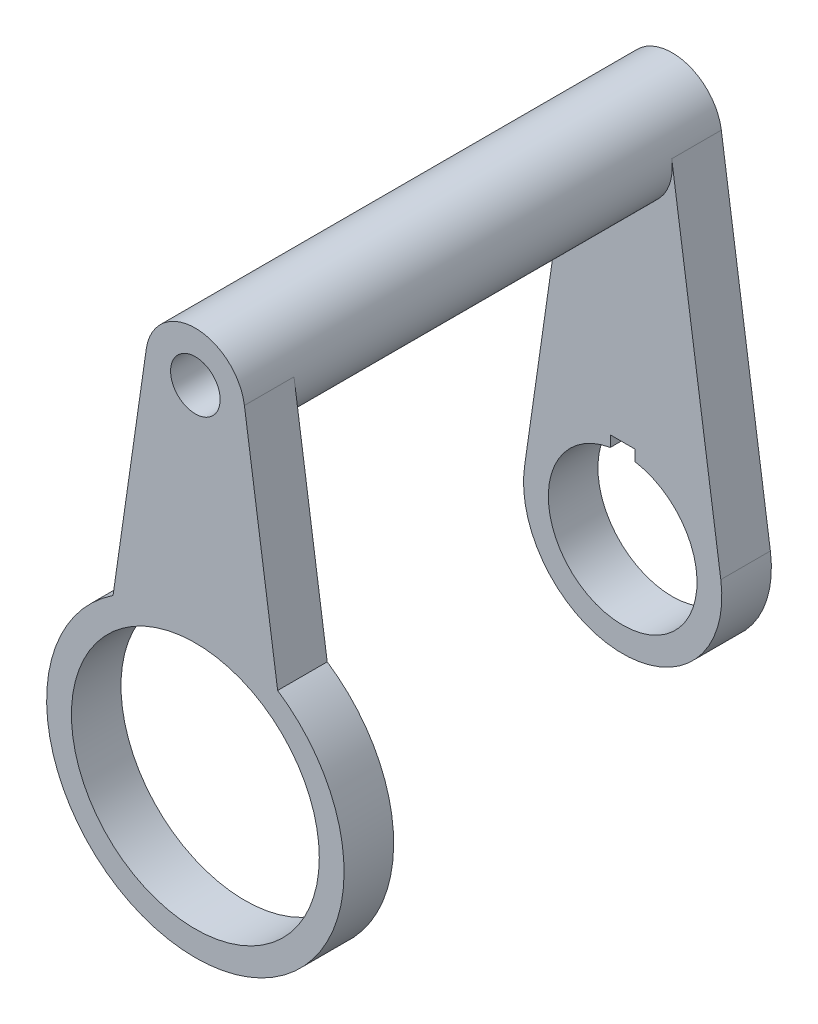
ISO-10303-21;
HEADER;
FILE_DESCRIPTION(('STEP AP214'),'2;1');
FILE_NAME('part.step','',(''),(''),'','','');
FILE_SCHEMA(('AUTOMOTIVE_DESIGN { 1 0 10303 214 1 1 1 1 }'));
ENDSEC;
DATA;
#1=APPLICATION_CONTEXT('core data for automotive mechanical design processes');
#2=APPLICATION_PROTOCOL_DEFINITION('international standard','automotive_design',2000,#1);
#3=PRODUCT_CONTEXT('',#1,'mechanical');
#4=PRODUCT('Part','Part','',(#3));
#5=PRODUCT_RELATED_PRODUCT_CATEGORY('part','',(#4));
#6=PRODUCT_DEFINITION_FORMATION('','',#4);
#7=PRODUCT_DEFINITION_CONTEXT('part definition',#1,'design');
#8=PRODUCT_DEFINITION('design','',#6,#7);
#9=PRODUCT_DEFINITION_SHAPE('','',#8);
#10=(LENGTH_UNIT() NAMED_UNIT(*) SI_UNIT(.MILLI.,.METRE.));
#11=(NAMED_UNIT(*) PLANE_ANGLE_UNIT() SI_UNIT($,.RADIAN.));
#12=(NAMED_UNIT(*) SI_UNIT($,.STERADIAN.) SOLID_ANGLE_UNIT());
#13=UNCERTAINTY_MEASURE_WITH_UNIT(LENGTH_MEASURE(1.E-05),#10,'distance_accuracy_value','');
#14=(GEOMETRIC_REPRESENTATION_CONTEXT(3) GLOBAL_UNCERTAINTY_ASSIGNED_CONTEXT((#13)) GLOBAL_UNIT_ASSIGNED_CONTEXT((#10,
#11,#12)) REPRESENTATION_CONTEXT('',''));
#15=CARTESIAN_POINT('',(0.,0.,0.));
#16=DIRECTION('',(0.,0.,1.));
#17=DIRECTION('',(1.,0.,0.));
#18=AXIS2_PLACEMENT_3D('',#15,#16,#17);
#19=CARTESIAN_POINT('',(0.,0.,10.));
#20=DIRECTION('',(0.,0.,1.));
#21=DIRECTION('',(1.,0.,0.));
#22=AXIS2_PLACEMENT_3D('',#19,#20,#21);
#23=PLANE('',#22);
#24=CARTESIAN_POINT('',(0.,70.,10.));
#25=DIRECTION('',(0.,0.,1.));
#26=DIRECTION('',(1.,0.,0.));
#27=AXIS2_PLACEMENT_3D('',#24,#25,#26);
#28=CIRCLE('',#27,10.);
#29=CARTESIAN_POINT('',(-9.89743318610788,71.4285714285714,10.));
#30=VERTEX_POINT('',#29);
#31=CARTESIAN_POINT('',(9.89743318610788,71.4285714285714,10.));
#32=VERTEX_POINT('',#31);
#33=EDGE_CURVE('E54',#30,#32,#28,.T.);
#34=ORIENTED_EDGE('',*,*,#33,.F.);
#35=DIRECTION('',(-0.142857142857143,-0.989743318610787,0.));
#36=VECTOR('',#35,1.);
#37=CARTESIAN_POINT('',(-19.7948663722158,2.85714285714286,10.));
#38=LINE('',#37,#36);
#39=CARTESIAN_POINT('',(-19.7948663722158,2.85714285714286,10.));
#40=VERTEX_POINT('',#39);
#41=EDGE_CURVE('E235',#30,#40,#38,.T.);
#42=ORIENTED_EDGE('',*,*,#41,.T.);
#43=CARTESIAN_POINT('',(0.,0.,10.));
#44=DIRECTION('',(0.,0.,1.));
#45=DIRECTION('',(1.,0.,0.));
#46=AXIS2_PLACEMENT_3D('',#43,#44,#45);
#47=CIRCLE('',#46,20.);
#48=CARTESIAN_POINT('',(19.7948663722157,2.85714285714286,10.));
#49=VERTEX_POINT('',#48);
#50=EDGE_CURVE('E226',#40,#49,#47,.T.);
#51=ORIENTED_EDGE('',*,*,#50,.T.);
#52=DIRECTION('',(-0.142857142857143,0.989743318610787,0.));
#53=VECTOR('',#52,1.);
#54=CARTESIAN_POINT('',(9.89743318610787,71.4285714285714,10.));
#55=LINE('',#54,#53);
#56=EDGE_CURVE('E230',#49,#32,#55,.T.);
#57=ORIENTED_EDGE('',*,*,#56,.T.);
#58=EDGE_LOOP('',(#34,#42,#51,#57));
#59=FACE_BOUND('',#58,.T.);
#60=DIRECTION('',(0.,1.,0.));
#61=VECTOR('',#60,1.);
#62=CARTESIAN_POINT('',(2.5,17.,10.));
#63=LINE('',#62,#61);
#64=CARTESIAN_POINT('',(2.5,14.790199457749,10.));
#65=VERTEX_POINT('',#64);
#66=CARTESIAN_POINT('',(2.5,17.,10.));
#67=VERTEX_POINT('',#66);
#68=EDGE_CURVE('E188',#65,#67,#63,.T.);
#69=ORIENTED_EDGE('',*,*,#68,.F.);
#70=CARTESIAN_POINT('',(0.,0.,10.));
#71=DIRECTION('',(0.,0.,1.));
#72=DIRECTION('',(1.,0.,0.));
#73=AXIS2_PLACEMENT_3D('',#70,#71,#72);
#74=CIRCLE('',#73,15.);
#75=CARTESIAN_POINT('',(-2.5,14.790199457749,10.));
#76=VERTEX_POINT('',#75);
#77=EDGE_CURVE('E185',#76,#65,#74,.T.);
#78=ORIENTED_EDGE('',*,*,#77,.F.);
#79=DIRECTION('',(0.,-1.,0.));
#80=VECTOR('',#79,1.);
#81=CARTESIAN_POINT('',(-2.5,14.790199457749,10.));
#82=LINE('',#81,#80);
#83=CARTESIAN_POINT('',(-2.5,17.,10.));
#84=VERTEX_POINT('',#83);
#85=EDGE_CURVE('E195',#84,#76,#82,.T.);
#86=ORIENTED_EDGE('',*,*,#85,.F.);
#87=DIRECTION('',(-1.,0.,0.));
#88=VECTOR('',#87,1.);
#89=CARTESIAN_POINT('',(-2.5,17.,10.));
#90=LINE('',#89,#88);
#91=EDGE_CURVE('E192',#67,#84,#90,.T.);
#92=ORIENTED_EDGE('',*,*,#91,.F.);
#93=EDGE_LOOP('',(#69,#78,#86,#92));
#94=FACE_BOUND('',#93,.T.);
#95=ADVANCED_FACE('F45',(#59,#94),#23,.T.);
#96=CARTESIAN_POINT('',(0.,0.,0.));
#97=DIRECTION('',(0.,0.,1.));
#98=DIRECTION('',(1.,0.,0.));
#99=AXIS2_PLACEMENT_3D('',#96,#97,#98);
#100=PLANE('',#99);
#101=CARTESIAN_POINT('',(0.,0.,0.));
#102=DIRECTION('',(0.,0.,1.));
#103=DIRECTION('',(1.,0.,0.));
#104=AXIS2_PLACEMENT_3D('',#101,#102,#103);
#105=CIRCLE('',#104,20.);
#106=CARTESIAN_POINT('',(-19.7948663722158,2.85714285714286,0.));
#107=VERTEX_POINT('',#106);
#108=CARTESIAN_POINT('',(19.7948663722157,2.85714285714286,0.));
#109=VERTEX_POINT('',#108);
#110=EDGE_CURVE('E225',#107,#109,#105,.T.);
#111=ORIENTED_EDGE('',*,*,#110,.F.);
#112=DIRECTION('',(-0.142857142857143,-0.989743318610787,0.));
#113=VECTOR('',#112,1.);
#114=CARTESIAN_POINT('',(-19.7948663722158,2.85714285714286,0.));
#115=LINE('',#114,#113);
#116=CARTESIAN_POINT('',(-9.89743318610788,71.4285714285714,0.));
#117=VERTEX_POINT('',#116);
#118=EDGE_CURVE('E231',#117,#107,#115,.T.);
#119=ORIENTED_EDGE('',*,*,#118,.F.);
#120=CARTESIAN_POINT('',(0.,70.,0.));
#121=DIRECTION('',(0.,0.,1.));
#122=DIRECTION('',(1.,0.,0.));
#123=AXIS2_PLACEMENT_3D('',#120,#121,#122);
#124=CIRCLE('',#123,10.);
#125=CARTESIAN_POINT('',(9.89743318610787,71.4285714285714,0.));
#126=VERTEX_POINT('',#125);
#127=EDGE_CURVE('E245',#126,#117,#124,.T.);
#128=ORIENTED_EDGE('',*,*,#127,.F.);
#129=DIRECTION('',(-0.142857142857143,0.989743318610787,0.));
#130=VECTOR('',#129,1.);
#131=CARTESIAN_POINT('',(9.89743318610787,71.4285714285714,0.));
#132=LINE('',#131,#130);
#133=EDGE_CURVE('E242',#109,#126,#132,.T.);
#134=ORIENTED_EDGE('',*,*,#133,.F.);
#135=EDGE_LOOP('',(#111,#119,#128,#134));
#136=FACE_BOUND('',#135,.T.);
#137=CARTESIAN_POINT('',(0.,0.,0.));
#138=DIRECTION('',(0.,0.,1.));
#139=DIRECTION('',(1.,0.,0.));
#140=AXIS2_PLACEMENT_3D('',#137,#138,#139);
#141=CIRCLE('',#140,15.);
#142=CARTESIAN_POINT('',(-2.5,14.790199457749,0.));
#143=VERTEX_POINT('',#142);
#144=CARTESIAN_POINT('',(2.5,14.790199457749,0.));
#145=VERTEX_POINT('',#144);
#146=EDGE_CURVE('E184',#143,#145,#141,.T.);
#147=ORIENTED_EDGE('',*,*,#146,.T.);
#148=DIRECTION('',(0.,1.,0.));
#149=VECTOR('',#148,1.);
#150=CARTESIAN_POINT('',(2.5,17.,0.));
#151=LINE('',#150,#149);
#152=CARTESIAN_POINT('',(2.5,17.,0.));
#153=VERTEX_POINT('',#152);
#154=EDGE_CURVE('E202',#145,#153,#151,.T.);
#155=ORIENTED_EDGE('',*,*,#154,.T.);
#156=DIRECTION('',(-1.,0.,0.));
#157=VECTOR('',#156,1.);
#158=CARTESIAN_POINT('',(-2.5,17.,0.));
#159=LINE('',#158,#157);
#160=CARTESIAN_POINT('',(-2.5,17.,0.));
#161=VERTEX_POINT('',#160);
#162=EDGE_CURVE('E206',#153,#161,#159,.T.);
#163=ORIENTED_EDGE('',*,*,#162,.T.);
#164=DIRECTION('',(0.,-1.,0.));
#165=VECTOR('',#164,1.);
#166=CARTESIAN_POINT('',(-2.5,14.790199457749,0.));
#167=LINE('',#166,#165);
#168=EDGE_CURVE('E189',#161,#143,#167,.T.);
#169=ORIENTED_EDGE('',*,*,#168,.T.);
#170=EDGE_LOOP('',(#147,#155,#163,#169));
#171=FACE_BOUND('',#170,.T.);
#172=CARTESIAN_POINT('',(0.,70.,0.));
#173=DIRECTION('',(0.,0.,1.));
#174=DIRECTION('',(1.,0.,0.));
#175=AXIS2_PLACEMENT_3D('',#172,#173,#174);
#176=CIRCLE('',#175,5.);
#177=CARTESIAN_POINT('',(5.,70.,0.));
#178=VERTEX_POINT('',#177);
#179=EDGE_CURVE('E176',#178,#178,#176,.T.);
#180=ORIENTED_EDGE('',*,*,#179,.T.);
#181=EDGE_LOOP('',(#180));
#182=FACE_BOUND('',#181,.T.);
#183=ADVANCED_FACE('F271',(#136,#171,#182),#100,.F.);
#184=CARTESIAN_POINT('',(0.,0.,10.));
#185=DIRECTION('',(0.,0.,-1.));
#186=DIRECTION('',(-1.,0.,0.));
#187=AXIS2_PLACEMENT_3D('',#184,#185,#186);
#188=CYLINDRICAL_SURFACE('',#187,20.);
#189=ORIENTED_EDGE('',*,*,#110,.T.);
#190=DIRECTION('',(0.,0.,-1.));
#191=VECTOR('',#190,1.);
#192=CARTESIAN_POINT('',(19.7948663722157,2.85714285714286,10.));
#193=LINE('',#192,#191);
#194=EDGE_CURVE('E180',#49,#109,#193,.T.);
#195=ORIENTED_EDGE('',*,*,#194,.F.);
#196=ORIENTED_EDGE('',*,*,#50,.F.);
#197=DIRECTION('',(0.,0.,-1.));
#198=VECTOR('',#197,1.);
#199=CARTESIAN_POINT('',(-19.7948663722158,2.85714285714286,10.));
#200=LINE('',#199,#198);
#201=EDGE_CURVE('E238',#40,#107,#200,.T.);
#202=ORIENTED_EDGE('',*,*,#201,.T.);
#203=EDGE_LOOP('',(#189,#195,#196,#202));
#204=FACE_BOUND('',#203,.T.);
#205=ADVANCED_FACE('F47',(#204),#188,.T.);
#206=CARTESIAN_POINT('',(9.89743318610787,71.4285714285714,10.));
#207=DIRECTION('',(-0.989743318610787,-0.142857142857143,0.));
#208=DIRECTION('',(0.142857142857143,-0.989743318610787,0.));
#209=AXIS2_PLACEMENT_3D('',#206,#207,#208);
#210=PLANE('',#209);
#211=ORIENTED_EDGE('',*,*,#133,.T.);
#212=DIRECTION('',(0.,0.,-1.));
#213=VECTOR('',#212,1.);
#214=CARTESIAN_POINT('',(9.89743318610787,71.4285714285714,10.));
#215=LINE('',#214,#213);
#216=EDGE_CURVE('E257',#32,#126,#215,.T.);
#217=ORIENTED_EDGE('',*,*,#216,.F.);
#218=ORIENTED_EDGE('',*,*,#56,.F.);
#219=ORIENTED_EDGE('',*,*,#194,.T.);
#220=EDGE_LOOP('',(#211,#217,#218,#219));
#221=FACE_BOUND('',#220,.T.);
#222=ADVANCED_FACE('F264',(#221),#210,.F.);
#223=CARTESIAN_POINT('',(0.,70.,10.));
#224=DIRECTION('',(0.,0.,-1.));
#225=DIRECTION('',(-1.,0.,0.));
#226=AXIS2_PLACEMENT_3D('',#223,#224,#225);
#227=CYLINDRICAL_SURFACE('',#226,10.);
#228=ORIENTED_EDGE('',*,*,#127,.T.);
#229=DIRECTION('',(0.,0.,-1.));
#230=VECTOR('',#229,1.);
#231=CARTESIAN_POINT('',(-9.89743318610788,71.4285714285714,10.));
#232=LINE('',#231,#230);
#233=EDGE_CURVE('E253',#30,#117,#232,.T.);
#234=ORIENTED_EDGE('',*,*,#233,.F.);
#235=ORIENTED_EDGE('',*,*,#33,.T.);
#236=ORIENTED_EDGE('',*,*,#216,.T.);
#237=EDGE_LOOP('',(#228,#234,#235,#236));
#238=FACE_BOUND('',#237,.T.);
#239=CARTESIAN_POINT('',(0.,70.,86.2));
#240=DIRECTION('',(0.,0.,1.));
#241=DIRECTION('',(1.,0.,0.));
#242=AXIS2_PLACEMENT_3D('',#239,#240,#241);
#243=CIRCLE('',#242,10.);
#244=CARTESIAN_POINT('',(-9.89743318610788,71.4285714285714,86.2));
#245=VERTEX_POINT('',#244);
#246=CARTESIAN_POINT('',(9.89743318610787,71.4285714285714,86.2));
#247=VERTEX_POINT('',#246);
#248=EDGE_CURVE('E173',#245,#247,#243,.T.);
#249=ORIENTED_EDGE('',*,*,#248,.F.);
#250=DIRECTION('',(0.,0.,-1.));
#251=VECTOR('',#250,1.);
#252=CARTESIAN_POINT('',(-9.89743318610788,71.4285714285714,96.2));
#253=LINE('',#252,#251);
#254=CARTESIAN_POINT('',(-9.89743318610788,71.4285714285714,96.2));
#255=VERTEX_POINT('',#254);
#256=EDGE_CURVE('E154',#255,#245,#253,.T.);
#257=ORIENTED_EDGE('',*,*,#256,.F.);
#258=CARTESIAN_POINT('',(0.,70.,96.2));
#259=DIRECTION('',(0.,0.,1.));
#260=DIRECTION('',(1.,0.,0.));
#261=AXIS2_PLACEMENT_3D('',#258,#259,#260);
#262=CIRCLE('',#261,10.);
#263=CARTESIAN_POINT('',(9.89743318610787,71.4285714285714,96.2));
#264=VERTEX_POINT('',#263);
#265=EDGE_CURVE('E159',#264,#255,#262,.T.);
#266=ORIENTED_EDGE('',*,*,#265,.F.);
#267=DIRECTION('',(0.,0.,-1.));
#268=VECTOR('',#267,1.);
#269=CARTESIAN_POINT('',(9.89743318610787,71.4285714285714,96.2));
#270=LINE('',#269,#268);
#271=EDGE_CURVE('E167',#264,#247,#270,.T.);
#272=ORIENTED_EDGE('',*,*,#271,.T.);
#273=EDGE_LOOP('',(#249,#257,#266,#272));
#274=FACE_BOUND('',#273,.T.);
#275=ADVANCED_FACE('F276',(#238,#274),#227,.T.);
#276=CARTESIAN_POINT('',(-19.7948663722158,2.85714285714286,10.));
#277=DIRECTION('',(0.989743318610787,-0.142857142857143,0.));
#278=DIRECTION('',(0.142857142857143,0.989743318610787,0.));
#279=AXIS2_PLACEMENT_3D('',#276,#277,#278);
#280=PLANE('',#279);
#281=ORIENTED_EDGE('',*,*,#118,.T.);
#282=ORIENTED_EDGE('',*,*,#201,.F.);
#283=ORIENTED_EDGE('',*,*,#41,.F.);
#284=ORIENTED_EDGE('',*,*,#233,.T.);
#285=EDGE_LOOP('',(#281,#282,#283,#284));
#286=FACE_BOUND('',#285,.T.);
#287=ADVANCED_FACE('F280',(#286),#280,.F.);
#288=CARTESIAN_POINT('',(0.,0.,10.));
#289=DIRECTION('',(0.,0.,-1.));
#290=DIRECTION('',(-1.,0.,0.));
#291=AXIS2_PLACEMENT_3D('',#288,#289,#290);
#292=CYLINDRICAL_SURFACE('',#291,15.);
#293=ORIENTED_EDGE('',*,*,#146,.F.);
#294=DIRECTION('',(0.,0.,-1.));
#295=VECTOR('',#294,1.);
#296=CARTESIAN_POINT('',(-2.5,14.790199457749,10.));
#297=LINE('',#296,#295);
#298=EDGE_CURVE('E198',#76,#143,#297,.T.);
#299=ORIENTED_EDGE('',*,*,#298,.F.);
#300=ORIENTED_EDGE('',*,*,#77,.T.);
#301=DIRECTION('',(0.,0.,-1.));
#302=VECTOR('',#301,1.);
#303=CARTESIAN_POINT('',(2.5,14.790199457749,10.));
#304=LINE('',#303,#302);
#305=EDGE_CURVE('E221',#65,#145,#304,.T.);
#306=ORIENTED_EDGE('',*,*,#305,.T.);
#307=EDGE_LOOP('',(#293,#299,#300,#306));
#308=FACE_BOUND('',#307,.T.);
#309=ADVANCED_FACE('F298',(#308),#292,.F.);
#310=CARTESIAN_POINT('',(2.5,17.,10.));
#311=DIRECTION('',(-1.,0.,0.));
#312=DIRECTION('',(0.,0.,1.));
#313=AXIS2_PLACEMENT_3D('',#310,#311,#312);
#314=PLANE('',#313);
#315=ORIENTED_EDGE('',*,*,#154,.F.);
#316=ORIENTED_EDGE('',*,*,#305,.F.);
#317=ORIENTED_EDGE('',*,*,#68,.T.);
#318=DIRECTION('',(0.,0.,-1.));
#319=VECTOR('',#318,1.);
#320=CARTESIAN_POINT('',(2.5,17.,10.));
#321=LINE('',#320,#319);
#322=EDGE_CURVE('E218',#67,#153,#321,.T.);
#323=ORIENTED_EDGE('',*,*,#322,.T.);
#324=EDGE_LOOP('',(#315,#316,#317,#323));
#325=FACE_BOUND('',#324,.T.);
#326=ADVANCED_FACE('F292',(#325),#314,.T.);
#327=CARTESIAN_POINT('',(-2.5,17.,10.));
#328=DIRECTION('',(0.,-1.,0.));
#329=DIRECTION('',(0.,0.,-1.));
#330=AXIS2_PLACEMENT_3D('',#327,#328,#329);
#331=PLANE('',#330);
#332=ORIENTED_EDGE('',*,*,#162,.F.);
#333=ORIENTED_EDGE('',*,*,#322,.F.);
#334=ORIENTED_EDGE('',*,*,#91,.T.);
#335=DIRECTION('',(0.,0.,-1.));
#336=VECTOR('',#335,1.);
#337=CARTESIAN_POINT('',(-2.5,17.,10.));
#338=LINE('',#337,#336);
#339=EDGE_CURVE('E69',#84,#161,#338,.T.);
#340=ORIENTED_EDGE('',*,*,#339,.T.);
#341=EDGE_LOOP('',(#332,#333,#334,#340));
#342=FACE_BOUND('',#341,.T.);
#343=ADVANCED_FACE('F295',(#342),#331,.T.);
#344=CARTESIAN_POINT('',(-2.5,14.790199457749,10.));
#345=DIRECTION('',(1.,0.,0.));
#346=DIRECTION('',(0.,0.,-1.));
#347=AXIS2_PLACEMENT_3D('',#344,#345,#346);
#348=PLANE('',#347);
#349=ORIENTED_EDGE('',*,*,#168,.F.);
#350=ORIENTED_EDGE('',*,*,#339,.F.);
#351=ORIENTED_EDGE('',*,*,#85,.T.);
#352=ORIENTED_EDGE('',*,*,#298,.T.);
#353=EDGE_LOOP('',(#349,#350,#351,#352));
#354=FACE_BOUND('',#353,.T.);
#355=ADVANCED_FACE('F300',(#354),#348,.T.);
#356=CARTESIAN_POINT('',(0.,70.,10.));
#357=DIRECTION('',(0.,0.,-1.));
#358=DIRECTION('',(-1.,0.,0.));
#359=AXIS2_PLACEMENT_3D('',#356,#357,#358);
#360=CYLINDRICAL_SURFACE('',#359,5.);
#361=ORIENTED_EDGE('',*,*,#179,.F.);
#362=EDGE_LOOP('',(#361));
#363=FACE_BOUND('',#362,.T.);
#364=CARTESIAN_POINT('',(0.,70.,96.2));
#365=DIRECTION('',(0.,0.,1.));
#366=DIRECTION('',(1.,0.,0.));
#367=AXIS2_PLACEMENT_3D('',#364,#365,#366);
#368=CIRCLE('',#367,5.);
#369=CARTESIAN_POINT('',(5.,70.,96.2));
#370=VERTEX_POINT('',#369);
#371=EDGE_CURVE('E143',#370,#370,#368,.T.);
#372=ORIENTED_EDGE('',*,*,#371,.T.);
#373=EDGE_LOOP('',(#372));
#374=FACE_BOUND('',#373,.T.);
#375=ADVANCED_FACE('F302',(#363,#374),#360,.F.);
#376=CARTESIAN_POINT('',(0.,70.,86.2));
#377=DIRECTION('',(0.,0.,1.));
#378=DIRECTION('',(1.,0.,0.));
#379=AXIS2_PLACEMENT_3D('',#376,#377,#378);
#380=PLANE('',#379);
#381=CARTESIAN_POINT('',(0.,0.,86.2));
#382=DIRECTION('',(0.,0.,1.));
#383=DIRECTION('',(1.,0.,0.));
#384=AXIS2_PLACEMENT_3D('',#381,#382,#383);
#385=CIRCLE('',#384,25.);
#386=CARTESIAN_POINT('',(25.,0.,86.2));
#387=VERTEX_POINT('',#386);
#388=EDGE_CURVE('E463',#387,#387,#385,.F.);
#389=ORIENTED_EDGE('',*,*,#388,.F.);
#390=EDGE_LOOP('',(#389));
#391=FACE_BOUND('',#390,.T.);
#392=DIRECTION('',(0.142857142857143,-0.989743318610787,0.));
#393=VECTOR('',#392,1.);
#394=CARTESIAN_POINT('',(9.89743318610787,71.4285714285714,86.2));
#395=LINE('',#394,#393);
#396=CARTESIAN_POINT('',(16.600483547216,24.9884762640424,86.2));
#397=VERTEX_POINT('',#396);
#398=EDGE_CURVE('E148',#247,#397,#395,.T.);
#399=ORIENTED_EDGE('',*,*,#398,.T.);
#400=CARTESIAN_POINT('',(0.,0.,86.2));
#401=DIRECTION('',(0.,0.,1.));
#402=DIRECTION('',(1.,0.,0.));
#403=AXIS2_PLACEMENT_3D('',#400,#401,#402);
#404=CIRCLE('',#403,30.);
#405=CARTESIAN_POINT('',(-16.6004835472161,24.9884762640424,86.2));
#406=VERTEX_POINT('',#405);
#407=EDGE_CURVE('E136',#397,#406,#404,.F.);
#408=ORIENTED_EDGE('',*,*,#407,.T.);
#409=DIRECTION('',(0.142857142857143,0.989743318610787,0.));
#410=VECTOR('',#409,1.);
#411=CARTESIAN_POINT('',(-9.89743318610788,71.4285714285714,86.2));
#412=LINE('',#411,#410);
#413=EDGE_CURVE('E61',#406,#245,#412,.T.);
#414=ORIENTED_EDGE('',*,*,#413,.T.);
#415=ORIENTED_EDGE('',*,*,#248,.T.);
#416=EDGE_LOOP('',(#399,#408,#414,#415));
#417=FACE_BOUND('',#416,.T.);
#418=ADVANCED_FACE('F146',(#391,#417),#380,.F.);
#419=CARTESIAN_POINT('',(0.,70.,96.2));
#420=DIRECTION('',(0.,0.,1.));
#421=DIRECTION('',(1.,0.,0.));
#422=AXIS2_PLACEMENT_3D('',#419,#420,#421);
#423=PLANE('',#422);
#424=CARTESIAN_POINT('',(0.,0.,96.2));
#425=DIRECTION('',(0.,0.,1.));
#426=DIRECTION('',(1.,0.,0.));
#427=AXIS2_PLACEMENT_3D('',#424,#425,#426);
#428=CIRCLE('',#427,25.);
#429=CARTESIAN_POINT('',(25.,0.,96.2));
#430=VERTEX_POINT('',#429);
#431=EDGE_CURVE('E466',#430,#430,#428,.T.);
#432=ORIENTED_EDGE('',*,*,#431,.F.);
#433=EDGE_LOOP('',(#432));
#434=FACE_BOUND('',#433,.T.);
#435=DIRECTION('',(0.142857142857143,0.989743318610787,0.));
#436=VECTOR('',#435,1.);
#437=CARTESIAN_POINT('',(-9.89743318610788,71.4285714285714,96.2));
#438=LINE('',#437,#436);
#439=CARTESIAN_POINT('',(-16.6004835472161,24.9884762640424,96.2));
#440=VERTEX_POINT('',#439);
#441=EDGE_CURVE('E476',#440,#255,#438,.T.);
#442=ORIENTED_EDGE('',*,*,#441,.F.);
#443=CARTESIAN_POINT('',(0.,0.,96.2));
#444=DIRECTION('',(0.,0.,1.));
#445=DIRECTION('',(1.,0.,0.));
#446=AXIS2_PLACEMENT_3D('',#443,#444,#445);
#447=CIRCLE('',#446,30.);
#448=CARTESIAN_POINT('',(16.600483547216,24.9884762640424,96.2));
#449=VERTEX_POINT('',#448);
#450=EDGE_CURVE('E139',#440,#449,#447,.T.);
#451=ORIENTED_EDGE('',*,*,#450,.T.);
#452=DIRECTION('',(0.142857142857143,-0.989743318610787,0.));
#453=VECTOR('',#452,1.);
#454=CARTESIAN_POINT('',(9.89743318610787,71.4285714285714,96.2));
#455=LINE('',#454,#453);
#456=EDGE_CURVE('E164',#264,#449,#455,.T.);
#457=ORIENTED_EDGE('',*,*,#456,.F.);
#458=ORIENTED_EDGE('',*,*,#265,.T.);
#459=EDGE_LOOP('',(#442,#451,#457,#458));
#460=FACE_BOUND('',#459,.T.);
#461=ORIENTED_EDGE('',*,*,#371,.F.);
#462=EDGE_LOOP('',(#461));
#463=FACE_BOUND('',#462,.T.);
#464=ADVANCED_FACE('F366',(#434,#460,#463),#423,.T.);
#465=CARTESIAN_POINT('',(-9.89743318610788,71.4285714285714,96.2));
#466=DIRECTION('',(-0.989743318610787,0.142857142857143,0.));
#467=DIRECTION('',(-0.142857142857143,-0.989743318610787,0.));
#468=AXIS2_PLACEMENT_3D('',#465,#466,#467);
#469=PLANE('',#468);
#470=DIRECTION('',(0.,0.,1.));
#471=VECTOR('',#470,1.);
#472=CARTESIAN_POINT('',(-16.6004835472161,24.9884762640424,1.34718625761429));
#473=LINE('',#472,#471);
#474=EDGE_CURVE('E134',#440,#406,#473,.F.);
#475=ORIENTED_EDGE('',*,*,#474,.F.);
#476=ORIENTED_EDGE('',*,*,#441,.T.);
#477=ORIENTED_EDGE('',*,*,#256,.T.);
#478=ORIENTED_EDGE('',*,*,#413,.F.);
#479=EDGE_LOOP('',(#475,#476,#477,#478));
#480=FACE_BOUND('',#479,.T.);
#481=ADVANCED_FACE('F152',(#480),#469,.T.);
#482=CARTESIAN_POINT('',(9.89743318610787,71.4285714285714,96.2));
#483=DIRECTION('',(0.989743318610787,0.142857142857143,0.));
#484=DIRECTION('',(-0.142857142857143,0.989743318610787,0.));
#485=AXIS2_PLACEMENT_3D('',#482,#483,#484);
#486=PLANE('',#485);
#487=DIRECTION('',(0.,0.,1.));
#488=VECTOR('',#487,1.);
#489=CARTESIAN_POINT('',(16.600483547216,24.9884762640424,1.34718625761429));
#490=LINE('',#489,#488);
#491=EDGE_CURVE('E11',#397,#449,#490,.T.);
#492=ORIENTED_EDGE('',*,*,#491,.F.);
#493=ORIENTED_EDGE('',*,*,#398,.F.);
#494=ORIENTED_EDGE('',*,*,#271,.F.);
#495=ORIENTED_EDGE('',*,*,#456,.T.);
#496=EDGE_LOOP('',(#492,#493,#494,#495));
#497=FACE_BOUND('',#496,.T.);
#498=ADVANCED_FACE('F365',(#497),#486,.T.);
#499=CARTESIAN_POINT('',(0.,0.,1.34718625761429));
#500=DIRECTION('',(0.,0.,1.));
#501=DIRECTION('',(1.,0.,0.));
#502=AXIS2_PLACEMENT_3D('',#499,#500,#501);
#503=CYLINDRICAL_SURFACE('',#502,30.);
#504=ORIENTED_EDGE('',*,*,#450,.F.);
#505=ORIENTED_EDGE('',*,*,#474,.T.);
#506=ORIENTED_EDGE('',*,*,#407,.F.);
#507=ORIENTED_EDGE('',*,*,#491,.T.);
#508=EDGE_LOOP('',(#504,#505,#506,#507));
#509=FACE_BOUND('',#508,.T.);
#510=ADVANCED_FACE('F135',(#509),#503,.T.);
#511=CARTESIAN_POINT('',(0.,0.,15.4893218813452));
#512=DIRECTION('',(0.,0.,1.));
#513=DIRECTION('',(1.,0.,0.));
#514=AXIS2_PLACEMENT_3D('',#511,#512,#513);
#515=CYLINDRICAL_SURFACE('',#514,25.);
#516=ORIENTED_EDGE('',*,*,#388,.T.);
#517=EDGE_LOOP('',(#516));
#518=FACE_BOUND('',#517,.T.);
#519=ORIENTED_EDGE('',*,*,#431,.T.);
#520=EDGE_LOOP('',(#519));
#521=FACE_BOUND('',#520,.T.);
#522=ADVANCED_FACE('F383',(#518,#521),#515,.F.);
#523=CLOSED_SHELL('',(#95,#183,#205,#222,#275,#287,#309,#326,#343,#355,#375,#418,#464,#481,#498,
#510,#522));
#524=MANIFOLD_SOLID_BREP('B2',#523);
#525=ADVANCED_BREP_SHAPE_REPRESENTATION('',(#18,#524),#14);
#526=SHAPE_DEFINITION_REPRESENTATION(#9,#525);
ENDSEC;
END-ISO-10303-21;
